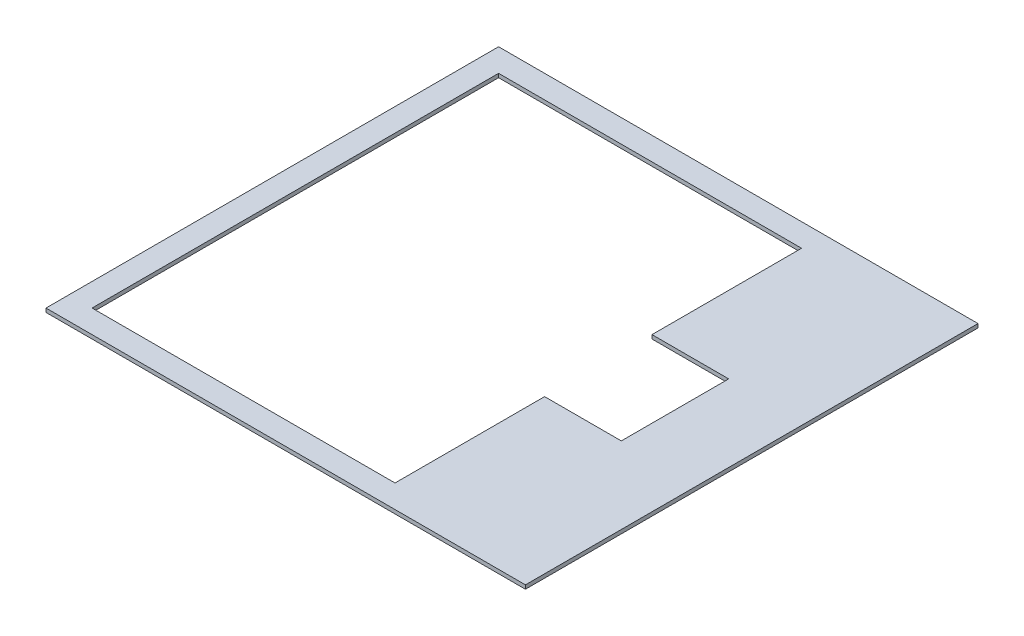
ISO-10303-21;
HEADER;
FILE_DESCRIPTION(('STEP AP214'),'2;1');
FILE_NAME('part.step','',(''),(''),'','','');
FILE_SCHEMA(('AUTOMOTIVE_DESIGN { 1 0 10303 214 1 1 1 1 }'));
ENDSEC;
DATA;
#1=APPLICATION_CONTEXT('core data for automotive mechanical design processes');
#2=APPLICATION_PROTOCOL_DEFINITION('international standard','automotive_design',2000,#1);
#3=PRODUCT_CONTEXT('',#1,'mechanical');
#4=PRODUCT('Part','Part','',(#3));
#5=PRODUCT_RELATED_PRODUCT_CATEGORY('part','',(#4));
#6=PRODUCT_DEFINITION_FORMATION('','',#4);
#7=PRODUCT_DEFINITION_CONTEXT('part definition',#1,'design');
#8=PRODUCT_DEFINITION('design','',#6,#7);
#9=PRODUCT_DEFINITION_SHAPE('','',#8);
#10=(LENGTH_UNIT() NAMED_UNIT(*) SI_UNIT(.MILLI.,.METRE.));
#11=(NAMED_UNIT(*) PLANE_ANGLE_UNIT() SI_UNIT($,.RADIAN.));
#12=(NAMED_UNIT(*) SI_UNIT($,.STERADIAN.) SOLID_ANGLE_UNIT());
#13=UNCERTAINTY_MEASURE_WITH_UNIT(LENGTH_MEASURE(1.E-05),#10,'distance_accuracy_value','');
#14=(GEOMETRIC_REPRESENTATION_CONTEXT(3) GLOBAL_UNCERTAINTY_ASSIGNED_CONTEXT((#13)) GLOBAL_UNIT_ASSIGNED_CONTEXT((#10,
#11,#12)) REPRESENTATION_CONTEXT('',''));
#15=CARTESIAN_POINT('',(0.,0.,0.));
#16=DIRECTION('',(0.,0.,1.));
#17=DIRECTION('',(1.,0.,0.));
#18=AXIS2_PLACEMENT_3D('',#15,#16,#17);
#19=CARTESIAN_POINT('',(112.5,-18.4,0.));
#20=DIRECTION('',(-1.,0.,0.));
#21=DIRECTION('',(0.,0.,1.));
#22=AXIS2_PLACEMENT_3D('',#19,#20,#21);
#23=PLANE('',#22);
#24=DIRECTION('',(0.,0.,1.));
#25=VECTOR('',#24,1.);
#26=CARTESIAN_POINT('',(112.5,0.,0.));
#27=LINE('',#26,#25);
#28=CARTESIAN_POINT('',(112.5,0.,-265.));
#29=VERTEX_POINT('',#28);
#30=CARTESIAN_POINT('',(112.5,0.,-70.0000000000001));
#31=VERTEX_POINT('',#30);
#32=EDGE_CURVE('E244',#29,#31,#27,.T.);
#33=ORIENTED_EDGE('',*,*,#32,.T.);
#34=DIRECTION('',(0.,1.,0.));
#35=VECTOR('',#34,1.);
#36=CARTESIAN_POINT('',(112.5,-18.4,-70.0000000000001));
#37=LINE('',#36,#35);
#38=CARTESIAN_POINT('',(112.5,5.,-70.0000000000001));
#39=VERTEX_POINT('',#38);
#40=EDGE_CURVE('E255',#31,#39,#37,.T.);
#41=ORIENTED_EDGE('',*,*,#40,.T.);
#42=DIRECTION('',(0.,0.,1.));
#43=VECTOR('',#42,1.);
#44=CARTESIAN_POINT('',(112.5,5.,0.));
#45=LINE('',#44,#43);
#46=CARTESIAN_POINT('',(112.5,5.,-265.));
#47=VERTEX_POINT('',#46);
#48=EDGE_CURVE('E177',#47,#39,#45,.T.);
#49=ORIENTED_EDGE('',*,*,#48,.F.);
#50=DIRECTION('',(0.,1.,0.));
#51=VECTOR('',#50,1.);
#52=CARTESIAN_POINT('',(112.5,-18.4,-265.));
#53=LINE('',#52,#51);
#54=EDGE_CURVE('E189',#29,#47,#53,.T.);
#55=ORIENTED_EDGE('',*,*,#54,.F.);
#56=EDGE_LOOP('',(#33,#41,#49,#55));
#57=FACE_BOUND('',#56,.T.);
#58=ADVANCED_FACE('F44',(#57),#23,.T.);
#59=CARTESIAN_POINT('',(312.5,5.,-295.));
#60=DIRECTION('',(-1.,0.,0.));
#61=DIRECTION('',(0.,0.,1.));
#62=AXIS2_PLACEMENT_3D('',#59,#60,#61);
#63=PLANE('',#62);
#64=DIRECTION('',(0.,0.,-1.));
#65=VECTOR('',#64,1.);
#66=CARTESIAN_POINT('',(312.5,0.,-295.));
#67=LINE('',#66,#65);
#68=CARTESIAN_POINT('',(312.5,0.,295.));
#69=VERTEX_POINT('',#68);
#70=CARTESIAN_POINT('',(312.5,0.,-295.));
#71=VERTEX_POINT('',#70);
#72=EDGE_CURVE('E188',#69,#71,#67,.T.);
#73=ORIENTED_EDGE('',*,*,#72,.T.);
#74=DIRECTION('',(0.,-1.,0.));
#75=VECTOR('',#74,1.);
#76=CARTESIAN_POINT('',(312.5,5.,-295.));
#77=LINE('',#76,#75);
#78=CARTESIAN_POINT('',(312.5,5.,-295.));
#79=VERTEX_POINT('',#78);
#80=EDGE_CURVE('E235',#79,#71,#77,.T.);
#81=ORIENTED_EDGE('',*,*,#80,.F.);
#82=DIRECTION('',(0.,0.,-1.));
#83=VECTOR('',#82,1.);
#84=CARTESIAN_POINT('',(312.5,5.,-295.));
#85=LINE('',#84,#83);
#86=CARTESIAN_POINT('',(312.5,5.,295.));
#87=VERTEX_POINT('',#86);
#88=EDGE_CURVE('E198',#87,#79,#85,.T.);
#89=ORIENTED_EDGE('',*,*,#88,.F.);
#90=DIRECTION('',(0.,-1.,0.));
#91=VECTOR('',#90,1.);
#92=CARTESIAN_POINT('',(312.5,5.,295.));
#93=LINE('',#92,#91);
#94=EDGE_CURVE('E212',#87,#69,#93,.T.);
#95=ORIENTED_EDGE('',*,*,#94,.T.);
#96=EDGE_LOOP('',(#73,#81,#89,#95));
#97=FACE_BOUND('',#96,.T.);
#98=ADVANCED_FACE('F46',(#97),#63,.F.);
#99=CARTESIAN_POINT('',(-312.5,5.,-295.));
#100=DIRECTION('',(0.,0.,1.));
#101=DIRECTION('',(1.,0.,0.));
#102=AXIS2_PLACEMENT_3D('',#99,#100,#101);
#103=PLANE('',#102);
#104=DIRECTION('',(-1.,0.,0.));
#105=VECTOR('',#104,1.);
#106=CARTESIAN_POINT('',(-312.5,0.,-295.));
#107=LINE('',#106,#105);
#108=CARTESIAN_POINT('',(-312.5,0.,-295.));
#109=VERTEX_POINT('',#108);
#110=EDGE_CURVE('E216',#71,#109,#107,.T.);
#111=ORIENTED_EDGE('',*,*,#110,.T.);
#112=DIRECTION('',(0.,-1.,0.));
#113=VECTOR('',#112,1.);
#114=CARTESIAN_POINT('',(-312.5,5.,-295.));
#115=LINE('',#114,#113);
#116=CARTESIAN_POINT('',(-312.5,5.,-295.));
#117=VERTEX_POINT('',#116);
#118=EDGE_CURVE('E231',#117,#109,#115,.T.);
#119=ORIENTED_EDGE('',*,*,#118,.F.);
#120=DIRECTION('',(-1.,0.,0.));
#121=VECTOR('',#120,1.);
#122=CARTESIAN_POINT('',(-312.5,5.,-295.));
#123=LINE('',#122,#121);
#124=EDGE_CURVE('E202',#79,#117,#123,.T.);
#125=ORIENTED_EDGE('',*,*,#124,.F.);
#126=ORIENTED_EDGE('',*,*,#80,.T.);
#127=EDGE_LOOP('',(#111,#119,#125,#126));
#128=FACE_BOUND('',#127,.T.);
#129=ADVANCED_FACE('F294',(#128),#103,.F.);
#130=CARTESIAN_POINT('',(-312.5,5.,-295.));
#131=DIRECTION('',(1.,0.,0.));
#132=DIRECTION('',(0.,0.,-1.));
#133=AXIS2_PLACEMENT_3D('',#130,#131,#132);
#134=PLANE('',#133);
#135=DIRECTION('',(0.,0.,1.));
#136=VECTOR('',#135,1.);
#137=CARTESIAN_POINT('',(-312.5,0.,-295.));
#138=LINE('',#137,#136);
#139=CARTESIAN_POINT('',(-312.5,0.,295.));
#140=VERTEX_POINT('',#139);
#141=EDGE_CURVE('E219',#109,#140,#138,.T.);
#142=ORIENTED_EDGE('',*,*,#141,.T.);
#143=DIRECTION('',(0.,-1.,0.));
#144=VECTOR('',#143,1.);
#145=CARTESIAN_POINT('',(-312.5,5.,295.));
#146=LINE('',#145,#144);
#147=CARTESIAN_POINT('',(-312.5,5.,295.));
#148=VERTEX_POINT('',#147);
#149=EDGE_CURVE('E227',#148,#140,#146,.T.);
#150=ORIENTED_EDGE('',*,*,#149,.F.);
#151=DIRECTION('',(0.,0.,1.));
#152=VECTOR('',#151,1.);
#153=CARTESIAN_POINT('',(-312.5,5.,-295.));
#154=LINE('',#153,#152);
#155=EDGE_CURVE('E206',#117,#148,#154,.T.);
#156=ORIENTED_EDGE('',*,*,#155,.F.);
#157=ORIENTED_EDGE('',*,*,#118,.T.);
#158=EDGE_LOOP('',(#142,#150,#156,#157));
#159=FACE_BOUND('',#158,.T.);
#160=ADVANCED_FACE('F392',(#159),#134,.F.);
#161=CARTESIAN_POINT('',(-312.5,5.,295.));
#162=DIRECTION('',(0.,0.,-1.));
#163=DIRECTION('',(-1.,0.,0.));
#164=AXIS2_PLACEMENT_3D('',#161,#162,#163);
#165=PLANE('',#164);
#166=DIRECTION('',(1.,0.,0.));
#167=VECTOR('',#166,1.);
#168=CARTESIAN_POINT('',(-312.5,0.,295.));
#169=LINE('',#168,#167);
#170=EDGE_CURVE('E203',#140,#69,#169,.T.);
#171=ORIENTED_EDGE('',*,*,#170,.T.);
#172=ORIENTED_EDGE('',*,*,#94,.F.);
#173=DIRECTION('',(1.,0.,0.));
#174=VECTOR('',#173,1.);
#175=CARTESIAN_POINT('',(-312.5,5.,295.));
#176=LINE('',#175,#174);
#177=EDGE_CURVE('E209',#148,#87,#176,.T.);
#178=ORIENTED_EDGE('',*,*,#177,.F.);
#179=ORIENTED_EDGE('',*,*,#149,.T.);
#180=EDGE_LOOP('',(#171,#172,#178,#179));
#181=FACE_BOUND('',#180,.T.);
#182=ADVANCED_FACE('F384',(#181),#165,.F.);
#183=CARTESIAN_POINT('',(0.,5.,0.));
#184=DIRECTION('',(0.,1.,0.));
#185=DIRECTION('',(0.,0.,1.));
#186=AXIS2_PLACEMENT_3D('',#183,#184,#185);
#187=PLANE('',#186);
#188=DIRECTION('',(1.,0.,0.));
#189=VECTOR('',#188,1.);
#190=CARTESIAN_POINT('',(0.,5.,70.));
#191=LINE('',#190,#189);
#192=CARTESIAN_POINT('',(112.5,5.,70.));
#193=VERTEX_POINT('',#192);
#194=CARTESIAN_POINT('',(212.5,5.,70.));
#195=VERTEX_POINT('',#194);
#196=EDGE_CURVE('E147',#193,#195,#191,.T.);
#197=ORIENTED_EDGE('',*,*,#196,.F.);
#198=CARTESIAN_POINT('',(112.5,5.,265.));
#199=VERTEX_POINT('',#198);
#200=EDGE_CURVE('E176',#193,#199,#45,.T.);
#201=ORIENTED_EDGE('',*,*,#200,.T.);
#202=DIRECTION('',(1.,0.,0.));
#203=VECTOR('',#202,1.);
#204=CARTESIAN_POINT('',(0.,5.,265.));
#205=LINE('',#204,#203);
#206=CARTESIAN_POINT('',(-282.5,5.,265.));
#207=VERTEX_POINT('',#206);
#208=EDGE_CURVE('E172',#207,#199,#205,.T.);
#209=ORIENTED_EDGE('',*,*,#208,.F.);
#210=DIRECTION('',(0.,0.,1.));
#211=VECTOR('',#210,1.);
#212=CARTESIAN_POINT('',(-282.5,5.,0.));
#213=LINE('',#212,#211);
#214=CARTESIAN_POINT('',(-282.5,5.,-265.));
#215=VERTEX_POINT('',#214);
#216=EDGE_CURVE('E68',#215,#207,#213,.T.);
#217=ORIENTED_EDGE('',*,*,#216,.F.);
#218=DIRECTION('',(1.,0.,0.));
#219=VECTOR('',#218,1.);
#220=CARTESIAN_POINT('',(0.,5.,-265.));
#221=LINE('',#220,#219);
#222=EDGE_CURVE('E180',#215,#47,#221,.T.);
#223=ORIENTED_EDGE('',*,*,#222,.T.);
#224=ORIENTED_EDGE('',*,*,#48,.T.);
#225=DIRECTION('',(1.,0.,0.));
#226=VECTOR('',#225,1.);
#227=CARTESIAN_POINT('',(0.,5.,-70.0000000000001));
#228=LINE('',#227,#226);
#229=CARTESIAN_POINT('',(212.5,5.,-70.0000000000001));
#230=VERTEX_POINT('',#229);
#231=EDGE_CURVE('E60',#39,#230,#228,.T.);
#232=ORIENTED_EDGE('',*,*,#231,.T.);
#233=DIRECTION('',(0.,0.,-1.));
#234=VECTOR('',#233,1.);
#235=CARTESIAN_POINT('',(212.5,5.,0.));
#236=LINE('',#235,#234);
#237=EDGE_CURVE('E140',#195,#230,#236,.T.);
#238=ORIENTED_EDGE('',*,*,#237,.F.);
#239=EDGE_LOOP('',(#197,#201,#209,#217,#223,#224,#232,#238));
#240=FACE_BOUND('',#239,.T.);
#241=ORIENTED_EDGE('',*,*,#88,.T.);
#242=ORIENTED_EDGE('',*,*,#124,.T.);
#243=ORIENTED_EDGE('',*,*,#155,.T.);
#244=ORIENTED_EDGE('',*,*,#177,.T.);
#245=EDGE_LOOP('',(#241,#242,#243,#244));
#246=FACE_BOUND('',#245,.T.);
#247=ADVANCED_FACE('F154',(#240,#246),#187,.T.);
#248=CARTESIAN_POINT('',(0.,0.,0.));
#249=DIRECTION('',(0.,1.,0.));
#250=DIRECTION('',(0.,0.,1.));
#251=AXIS2_PLACEMENT_3D('',#248,#249,#250);
#252=PLANE('',#251);
#253=CARTESIAN_POINT('',(112.5,0.,70.));
#254=VERTEX_POINT('',#253);
#255=CARTESIAN_POINT('',(112.5,0.,265.));
#256=VERTEX_POINT('',#255);
#257=EDGE_CURVE('E243',#254,#256,#27,.T.);
#258=ORIENTED_EDGE('',*,*,#257,.F.);
#259=DIRECTION('',(1.,0.,0.));
#260=VECTOR('',#259,1.);
#261=CARTESIAN_POINT('',(0.,0.,70.));
#262=LINE('',#261,#260);
#263=CARTESIAN_POINT('',(212.5,0.,70.));
#264=VERTEX_POINT('',#263);
#265=EDGE_CURVE('E167',#254,#264,#262,.T.);
#266=ORIENTED_EDGE('',*,*,#265,.T.);
#267=DIRECTION('',(0.,0.,-1.));
#268=VECTOR('',#267,1.);
#269=CARTESIAN_POINT('',(212.5,0.,0.));
#270=LINE('',#269,#268);
#271=CARTESIAN_POINT('',(212.5,0.,-70.0000000000001));
#272=VERTEX_POINT('',#271);
#273=EDGE_CURVE('E11',#264,#272,#270,.T.);
#274=ORIENTED_EDGE('',*,*,#273,.T.);
#275=DIRECTION('',(1.,0.,0.));
#276=VECTOR('',#275,1.);
#277=CARTESIAN_POINT('',(0.,0.,-70.0000000000001));
#278=LINE('',#277,#276);
#279=EDGE_CURVE('E163',#31,#272,#278,.T.);
#280=ORIENTED_EDGE('',*,*,#279,.F.);
#281=ORIENTED_EDGE('',*,*,#32,.F.);
#282=DIRECTION('',(1.,0.,0.));
#283=VECTOR('',#282,1.);
#284=CARTESIAN_POINT('',(0.,0.,-265.));
#285=LINE('',#284,#283);
#286=CARTESIAN_POINT('',(-282.5,0.,-265.));
#287=VERTEX_POINT('',#286);
#288=EDGE_CURVE('E248',#287,#29,#285,.T.);
#289=ORIENTED_EDGE('',*,*,#288,.F.);
#290=DIRECTION('',(0.,0.,1.));
#291=VECTOR('',#290,1.);
#292=CARTESIAN_POINT('',(-282.5,0.,0.));
#293=LINE('',#292,#291);
#294=CARTESIAN_POINT('',(-282.5,0.,265.));
#295=VERTEX_POINT('',#294);
#296=EDGE_CURVE('E251',#287,#295,#293,.T.);
#297=ORIENTED_EDGE('',*,*,#296,.T.);
#298=DIRECTION('',(1.,0.,0.));
#299=VECTOR('',#298,1.);
#300=CARTESIAN_POINT('',(0.,0.,265.));
#301=LINE('',#300,#299);
#302=EDGE_CURVE('E239',#295,#256,#301,.T.);
#303=ORIENTED_EDGE('',*,*,#302,.T.);
#304=EDGE_LOOP('',(#258,#266,#274,#280,#281,#289,#297,#303));
#305=FACE_BOUND('',#304,.T.);
#306=ORIENTED_EDGE('',*,*,#72,.F.);
#307=ORIENTED_EDGE('',*,*,#170,.F.);
#308=ORIENTED_EDGE('',*,*,#141,.F.);
#309=ORIENTED_EDGE('',*,*,#110,.F.);
#310=EDGE_LOOP('',(#306,#307,#308,#309));
#311=FACE_BOUND('',#310,.T.);
#312=ADVANCED_FACE('F271',(#305,#311),#252,.F.);
#313=CARTESIAN_POINT('',(-282.5,-18.4,0.));
#314=DIRECTION('',(-1.,0.,0.));
#315=DIRECTION('',(0.,0.,1.));
#316=AXIS2_PLACEMENT_3D('',#313,#314,#315);
#317=PLANE('',#316);
#318=DIRECTION('',(0.,1.,0.));
#319=VECTOR('',#318,1.);
#320=CARTESIAN_POINT('',(-282.5,-18.4,-265.));
#321=LINE('',#320,#319);
#322=EDGE_CURVE('E185',#287,#215,#321,.T.);
#323=ORIENTED_EDGE('',*,*,#322,.T.);
#324=ORIENTED_EDGE('',*,*,#216,.T.);
#325=DIRECTION('',(0.,1.,0.));
#326=VECTOR('',#325,1.);
#327=CARTESIAN_POINT('',(-282.5,-18.4,265.));
#328=LINE('',#327,#326);
#329=EDGE_CURVE('E184',#295,#207,#328,.T.);
#330=ORIENTED_EDGE('',*,*,#329,.F.);
#331=ORIENTED_EDGE('',*,*,#296,.F.);
#332=EDGE_LOOP('',(#323,#324,#330,#331));
#333=FACE_BOUND('',#332,.T.);
#334=ADVANCED_FACE('F267',(#333),#317,.F.);
#335=CARTESIAN_POINT('',(0.,-18.4,-265.));
#336=DIRECTION('',(0.,0.,1.));
#337=DIRECTION('',(1.,0.,0.));
#338=AXIS2_PLACEMENT_3D('',#335,#336,#337);
#339=PLANE('',#338);
#340=ORIENTED_EDGE('',*,*,#288,.T.);
#341=ORIENTED_EDGE('',*,*,#54,.T.);
#342=ORIENTED_EDGE('',*,*,#222,.F.);
#343=ORIENTED_EDGE('',*,*,#322,.F.);
#344=EDGE_LOOP('',(#340,#341,#342,#343));
#345=FACE_BOUND('',#344,.T.);
#346=ADVANCED_FACE('F277',(#345),#339,.T.);
#347=DIRECTION('',(0.,1.,0.));
#348=VECTOR('',#347,1.);
#349=CARTESIAN_POINT('',(112.5,-18.4,70.));
#350=LINE('',#349,#348);
#351=EDGE_CURVE('E53',#254,#193,#350,.T.);
#352=ORIENTED_EDGE('',*,*,#351,.F.);
#353=ORIENTED_EDGE('',*,*,#257,.T.);
#354=DIRECTION('',(0.,1.,0.));
#355=VECTOR('',#354,1.);
#356=CARTESIAN_POINT('',(112.5,-18.4,265.));
#357=LINE('',#356,#355);
#358=EDGE_CURVE('E192',#256,#199,#357,.T.);
#359=ORIENTED_EDGE('',*,*,#358,.T.);
#360=ORIENTED_EDGE('',*,*,#200,.F.);
#361=EDGE_LOOP('',(#352,#353,#359,#360));
#362=FACE_BOUND('',#361,.T.);
#363=ADVANCED_FACE('F263',(#362),#23,.T.);
#364=CARTESIAN_POINT('',(0.,-18.4,265.));
#365=DIRECTION('',(0.,0.,1.));
#366=DIRECTION('',(1.,0.,0.));
#367=AXIS2_PLACEMENT_3D('',#364,#365,#366);
#368=PLANE('',#367);
#369=ORIENTED_EDGE('',*,*,#329,.T.);
#370=ORIENTED_EDGE('',*,*,#208,.T.);
#371=ORIENTED_EDGE('',*,*,#358,.F.);
#372=ORIENTED_EDGE('',*,*,#302,.F.);
#373=EDGE_LOOP('',(#369,#370,#371,#372));
#374=FACE_BOUND('',#373,.T.);
#375=ADVANCED_FACE('F266',(#374),#368,.F.);
#376=CARTESIAN_POINT('',(212.5,-18.4,0.));
#377=DIRECTION('',(1.,0.,0.));
#378=DIRECTION('',(0.,0.,-1.));
#379=AXIS2_PLACEMENT_3D('',#376,#377,#378);
#380=PLANE('',#379);
#381=DIRECTION('',(0.,1.,0.));
#382=VECTOR('',#381,1.);
#383=CARTESIAN_POINT('',(212.5,-18.4,70.));
#384=LINE('',#383,#382);
#385=EDGE_CURVE('E135',#264,#195,#384,.T.);
#386=ORIENTED_EDGE('',*,*,#385,.T.);
#387=ORIENTED_EDGE('',*,*,#237,.T.);
#388=DIRECTION('',(0.,1.,0.));
#389=VECTOR('',#388,1.);
#390=CARTESIAN_POINT('',(212.5,-18.4,-70.0000000000001));
#391=LINE('',#390,#389);
#392=EDGE_CURVE('E144',#272,#230,#391,.T.);
#393=ORIENTED_EDGE('',*,*,#392,.F.);
#394=ORIENTED_EDGE('',*,*,#273,.F.);
#395=EDGE_LOOP('',(#386,#387,#393,#394));
#396=FACE_BOUND('',#395,.T.);
#397=ADVANCED_FACE('F137',(#396),#380,.F.);
#398=CARTESIAN_POINT('',(0.,-18.4,70.));
#399=DIRECTION('',(0.,0.,1.));
#400=DIRECTION('',(1.,0.,0.));
#401=AXIS2_PLACEMENT_3D('',#398,#399,#400);
#402=PLANE('',#401);
#403=ORIENTED_EDGE('',*,*,#351,.T.);
#404=ORIENTED_EDGE('',*,*,#196,.T.);
#405=ORIENTED_EDGE('',*,*,#385,.F.);
#406=ORIENTED_EDGE('',*,*,#265,.F.);
#407=EDGE_LOOP('',(#403,#404,#405,#406));
#408=FACE_BOUND('',#407,.T.);
#409=ADVANCED_FACE('F148',(#408),#402,.F.);
#410=CARTESIAN_POINT('',(0.,-18.4,-70.0000000000001));
#411=DIRECTION('',(0.,0.,1.));
#412=DIRECTION('',(1.,0.,0.));
#413=AXIS2_PLACEMENT_3D('',#410,#411,#412);
#414=PLANE('',#413);
#415=ORIENTED_EDGE('',*,*,#279,.T.);
#416=ORIENTED_EDGE('',*,*,#392,.T.);
#417=ORIENTED_EDGE('',*,*,#231,.F.);
#418=ORIENTED_EDGE('',*,*,#40,.F.);
#419=EDGE_LOOP('',(#415,#416,#417,#418));
#420=FACE_BOUND('',#419,.T.);
#421=ADVANCED_FACE('F281',(#420),#414,.T.);
#422=CLOSED_SHELL('',(#58,#98,#129,#160,#182,#247,#312,#334,#346,#363,#375,#397,#409,#421));
#423=MANIFOLD_SOLID_BREP('B2',#422);
#424=ADVANCED_BREP_SHAPE_REPRESENTATION('',(#18,#423),#14);
#425=SHAPE_DEFINITION_REPRESENTATION(#9,#424);
ENDSEC;
END-ISO-10303-21;
